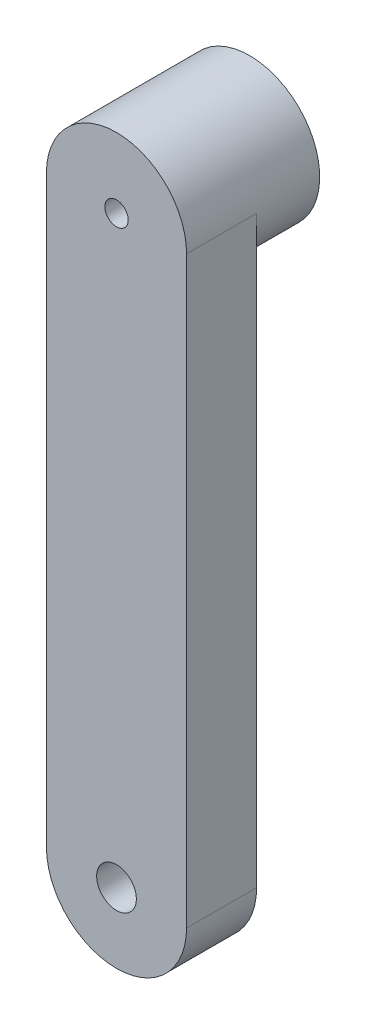
ISO-10303-21;
HEADER;
FILE_DESCRIPTION(('STEP AP214'),'2;1');
FILE_NAME('part.step','',(''),(''),'','','');
FILE_SCHEMA(('AUTOMOTIVE_DESIGN { 1 0 10303 214 1 1 1 1 }'));
ENDSEC;
DATA;
#1=APPLICATION_CONTEXT('core data for automotive mechanical design processes');
#2=APPLICATION_PROTOCOL_DEFINITION('international standard','automotive_design',2000,#1);
#3=PRODUCT_CONTEXT('',#1,'mechanical');
#4=PRODUCT('Part','Part','',(#3));
#5=PRODUCT_RELATED_PRODUCT_CATEGORY('part','',(#4));
#6=PRODUCT_DEFINITION_FORMATION('','',#4);
#7=PRODUCT_DEFINITION_CONTEXT('part definition',#1,'design');
#8=PRODUCT_DEFINITION('design','',#6,#7);
#9=PRODUCT_DEFINITION_SHAPE('','',#8);
#10=(LENGTH_UNIT() NAMED_UNIT(*) SI_UNIT(.MILLI.,.METRE.));
#11=(NAMED_UNIT(*) PLANE_ANGLE_UNIT() SI_UNIT($,.RADIAN.));
#12=(NAMED_UNIT(*) SI_UNIT($,.STERADIAN.) SOLID_ANGLE_UNIT());
#13=UNCERTAINTY_MEASURE_WITH_UNIT(LENGTH_MEASURE(1.E-05),#10,'distance_accuracy_value','');
#14=(GEOMETRIC_REPRESENTATION_CONTEXT(3) GLOBAL_UNCERTAINTY_ASSIGNED_CONTEXT((#13)) GLOBAL_UNIT_ASSIGNED_CONTEXT((#10,
#11,#12)) REPRESENTATION_CONTEXT('',''));
#15=CARTESIAN_POINT('',(0.,0.,0.));
#16=DIRECTION('',(0.,0.,1.));
#17=DIRECTION('',(1.,0.,0.));
#18=AXIS2_PLACEMENT_3D('',#15,#16,#17);
#19=CARTESIAN_POINT('',(0.,0.,3.));
#20=DIRECTION('',(0.,0.,-1.));
#21=DIRECTION('',(-1.,0.,0.));
#22=AXIS2_PLACEMENT_3D('',#19,#20,#21);
#23=CYLINDRICAL_SURFACE('',#22,3.);
#24=CARTESIAN_POINT('',(0.,0.,0.));
#25=DIRECTION('',(0.,0.,1.));
#26=DIRECTION('',(1.,0.,0.));
#27=AXIS2_PLACEMENT_3D('',#24,#25,#26);
#28=CIRCLE('',#27,3.);
#29=CARTESIAN_POINT('',(-3.,0.,0.));
#30=VERTEX_POINT('',#29);
#31=CARTESIAN_POINT('',(3.,0.,0.));
#32=VERTEX_POINT('',#31);
#33=EDGE_CURVE('E81',#30,#32,#28,.T.);
#34=ORIENTED_EDGE('',*,*,#33,.T.);
#35=DIRECTION('',(0.,0.,-1.));
#36=VECTOR('',#35,1.);
#37=CARTESIAN_POINT('',(3.,0.,3.));
#38=LINE('',#37,#36);
#39=CARTESIAN_POINT('',(3.,0.,3.));
#40=VERTEX_POINT('',#39);
#41=EDGE_CURVE('E35',#40,#32,#38,.T.);
#42=ORIENTED_EDGE('',*,*,#41,.F.);
#43=CARTESIAN_POINT('',(0.,0.,3.));
#44=DIRECTION('',(0.,0.,1.));
#45=DIRECTION('',(1.,0.,0.));
#46=AXIS2_PLACEMENT_3D('',#43,#44,#45);
#47=CIRCLE('',#46,3.);
#48=CARTESIAN_POINT('',(-3.,0.,3.));
#49=VERTEX_POINT('',#48);
#50=EDGE_CURVE('E82',#49,#40,#47,.T.);
#51=ORIENTED_EDGE('',*,*,#50,.F.);
#52=DIRECTION('',(0.,0.,-1.));
#53=VECTOR('',#52,1.);
#54=CARTESIAN_POINT('',(-3.,0.,3.));
#55=LINE('',#54,#53);
#56=EDGE_CURVE('E91',#49,#30,#55,.T.);
#57=ORIENTED_EDGE('',*,*,#56,.T.);
#58=EDGE_LOOP('',(#34,#42,#51,#57));
#59=FACE_BOUND('',#58,.T.);
#60=ADVANCED_FACE('F32',(#59),#23,.T.);
#61=CARTESIAN_POINT('',(3.,0.,3.));
#62=DIRECTION('',(-1.,0.,0.));
#63=DIRECTION('',(0.,0.,1.));
#64=AXIS2_PLACEMENT_3D('',#61,#62,#63);
#65=PLANE('',#64);
#66=DIRECTION('',(0.,1.,0.));
#67=VECTOR('',#66,1.);
#68=CARTESIAN_POINT('',(3.,0.,0.));
#69=LINE('',#68,#67);
#70=CARTESIAN_POINT('',(3.,25.,0.));
#71=VERTEX_POINT('',#70);
#72=EDGE_CURVE('E83',#32,#71,#69,.T.);
#73=ORIENTED_EDGE('',*,*,#72,.T.);
#74=DIRECTION('',(0.,0.,-1.));
#75=VECTOR('',#74,1.);
#76=CARTESIAN_POINT('',(3.,25.,3.));
#77=LINE('',#76,#75);
#78=CARTESIAN_POINT('',(3.,25.,3.));
#79=VERTEX_POINT('',#78);
#80=EDGE_CURVE('E90',#79,#71,#77,.T.);
#81=ORIENTED_EDGE('',*,*,#80,.F.);
#82=DIRECTION('',(0.,1.,0.));
#83=VECTOR('',#82,1.);
#84=CARTESIAN_POINT('',(3.,0.,3.));
#85=LINE('',#84,#83);
#86=EDGE_CURVE('E75',#40,#79,#85,.T.);
#87=ORIENTED_EDGE('',*,*,#86,.F.);
#88=ORIENTED_EDGE('',*,*,#41,.T.);
#89=EDGE_LOOP('',(#73,#81,#87,#88));
#90=FACE_BOUND('',#89,.T.);
#91=ADVANCED_FACE('F131',(#90),#65,.F.);
#92=CARTESIAN_POINT('',(0.,25.,3.));
#93=DIRECTION('',(0.,0.,-1.));
#94=DIRECTION('',(-1.,0.,0.));
#95=AXIS2_PLACEMENT_3D('',#92,#93,#94);
#96=CYLINDRICAL_SURFACE('',#95,3.);
#97=ORIENTED_EDGE('',*,*,#80,.T.);
#98=CARTESIAN_POINT('',(0.,25.,0.));
#99=DIRECTION('',(0.,0.,-1.));
#100=DIRECTION('',(-1.,0.,0.));
#101=AXIS2_PLACEMENT_3D('',#98,#99,#100);
#102=CIRCLE('',#101,3.);
#103=CARTESIAN_POINT('',(-3.,25.,0.));
#104=VERTEX_POINT('',#103);
#105=EDGE_CURVE('E11',#71,#104,#102,.T.);
#106=ORIENTED_EDGE('',*,*,#105,.T.);
#107=DIRECTION('',(0.,0.,-1.));
#108=VECTOR('',#107,1.);
#109=CARTESIAN_POINT('',(-3.,25.,3.));
#110=LINE('',#109,#108);
#111=CARTESIAN_POINT('',(-3.,25.,3.));
#112=VERTEX_POINT('',#111);
#113=EDGE_CURVE('E86',#112,#104,#110,.T.);
#114=ORIENTED_EDGE('',*,*,#113,.F.);
#115=CARTESIAN_POINT('',(0.,25.,3.));
#116=DIRECTION('',(0.,0.,1.));
#117=DIRECTION('',(1.,0.,0.));
#118=AXIS2_PLACEMENT_3D('',#115,#116,#117);
#119=CIRCLE('',#118,3.);
#120=EDGE_CURVE('E96',#79,#112,#119,.T.);
#121=ORIENTED_EDGE('',*,*,#120,.F.);
#122=EDGE_LOOP('',(#97,#106,#114,#121));
#123=FACE_BOUND('',#122,.T.);
#124=CARTESIAN_POINT('',(0.,25.,-2.7));
#125=DIRECTION('',(0.,0.,-1.));
#126=DIRECTION('',(-1.,0.,0.));
#127=AXIS2_PLACEMENT_3D('',#124,#125,#126);
#128=CIRCLE('',#127,3.);
#129=CARTESIAN_POINT('',(-3.,25.,-2.7));
#130=VERTEX_POINT('',#129);
#131=EDGE_CURVE('E110',#130,#130,#128,.T.);
#132=ORIENTED_EDGE('',*,*,#131,.F.);
#133=EDGE_LOOP('',(#132));
#134=FACE_BOUND('',#133,.T.);
#135=ADVANCED_FACE('F94',(#123,#134),#96,.T.);
#136=CARTESIAN_POINT('',(-3.,0.,3.));
#137=DIRECTION('',(1.,0.,0.));
#138=DIRECTION('',(0.,0.,-1.));
#139=AXIS2_PLACEMENT_3D('',#136,#137,#138);
#140=PLANE('',#139);
#141=DIRECTION('',(0.,-1.,0.));
#142=VECTOR('',#141,1.);
#143=CARTESIAN_POINT('',(-3.,0.,0.));
#144=LINE('',#143,#142);
#145=EDGE_CURVE('E67',#104,#30,#144,.T.);
#146=ORIENTED_EDGE('',*,*,#145,.T.);
#147=ORIENTED_EDGE('',*,*,#56,.F.);
#148=DIRECTION('',(0.,-1.,0.));
#149=VECTOR('',#148,1.);
#150=CARTESIAN_POINT('',(-3.,0.,3.));
#151=LINE('',#150,#149);
#152=EDGE_CURVE('E49',#112,#49,#151,.T.);
#153=ORIENTED_EDGE('',*,*,#152,.F.);
#154=ORIENTED_EDGE('',*,*,#113,.T.);
#155=EDGE_LOOP('',(#146,#147,#153,#154));
#156=FACE_BOUND('',#155,.T.);
#157=ADVANCED_FACE('F87',(#156),#140,.F.);
#158=CARTESIAN_POINT('',(0.,0.,3.));
#159=DIRECTION('',(0.,0.,1.));
#160=DIRECTION('',(1.,0.,0.));
#161=AXIS2_PLACEMENT_3D('',#158,#159,#160);
#162=PLANE('',#161);
#163=CARTESIAN_POINT('',(0.,25.,3.));
#164=DIRECTION('',(0.,0.,1.));
#165=DIRECTION('',(1.,0.,0.));
#166=AXIS2_PLACEMENT_3D('',#163,#164,#165);
#167=CIRCLE('',#166,0.5);
#168=CARTESIAN_POINT('',(0.5,25.,3.));
#169=VERTEX_POINT('',#168);
#170=EDGE_CURVE('E114',#169,#169,#167,.T.);
#171=ORIENTED_EDGE('',*,*,#170,.F.);
#172=EDGE_LOOP('',(#171));
#173=FACE_BOUND('',#172,.T.);
#174=CARTESIAN_POINT('',(0.,0.,3.));
#175=DIRECTION('',(0.,0.,1.));
#176=DIRECTION('',(1.,0.,0.));
#177=AXIS2_PLACEMENT_3D('',#174,#175,#176);
#178=CIRCLE('',#177,0.85);
#179=CARTESIAN_POINT('',(0.85,0.,3.));
#180=VERTEX_POINT('',#179);
#181=EDGE_CURVE('E108',#180,#180,#178,.T.);
#182=ORIENTED_EDGE('',*,*,#181,.F.);
#183=EDGE_LOOP('',(#182));
#184=FACE_BOUND('',#183,.T.);
#185=ORIENTED_EDGE('',*,*,#50,.T.);
#186=ORIENTED_EDGE('',*,*,#86,.T.);
#187=ORIENTED_EDGE('',*,*,#120,.T.);
#188=ORIENTED_EDGE('',*,*,#152,.T.);
#189=EDGE_LOOP('',(#185,#186,#187,#188));
#190=FACE_BOUND('',#189,.T.);
#191=ADVANCED_FACE('F123',(#173,#184,#190),#162,.T.);
#192=CARTESIAN_POINT('',(0.,0.,0.));
#193=DIRECTION('',(0.,0.,1.));
#194=DIRECTION('',(1.,0.,0.));
#195=AXIS2_PLACEMENT_3D('',#192,#193,#194);
#196=PLANE('',#195);
#197=ORIENTED_EDGE('',*,*,#105,.F.);
#198=ORIENTED_EDGE('',*,*,#72,.F.);
#199=ORIENTED_EDGE('',*,*,#33,.F.);
#200=ORIENTED_EDGE('',*,*,#145,.F.);
#201=EDGE_LOOP('',(#197,#198,#199,#200));
#202=FACE_BOUND('',#201,.T.);
#203=CARTESIAN_POINT('',(0.,0.,0.));
#204=DIRECTION('',(0.,0.,1.));
#205=DIRECTION('',(1.,0.,0.));
#206=AXIS2_PLACEMENT_3D('',#203,#204,#205);
#207=CIRCLE('',#206,0.85);
#208=CARTESIAN_POINT('',(0.85,0.,0.));
#209=VERTEX_POINT('',#208);
#210=EDGE_CURVE('E101',#209,#209,#207,.F.);
#211=ORIENTED_EDGE('',*,*,#210,.F.);
#212=EDGE_LOOP('',(#211));
#213=FACE_BOUND('',#212,.T.);
#214=ADVANCED_FACE('F78',(#202,#213),#196,.F.);
#215=CARTESIAN_POINT('',(0.,0.,-0.00100000000000013));
#216=DIRECTION('',(0.,0.,1.));
#217=DIRECTION('',(1.,0.,0.));
#218=AXIS2_PLACEMENT_3D('',#215,#216,#217);
#219=CYLINDRICAL_SURFACE('',#218,0.85);
#220=CARTESIAN_POINT('',(0.85,0.,3.));
#221=CARTESIAN_POINT('',(0.85,0.,2.96875));
#222=CARTESIAN_POINT('',(0.85,0.,2.9375));
#223=CARTESIAN_POINT('',(0.85,0.,2.875));
#224=CARTESIAN_POINT('',(0.85,0.,2.84375));
#225=CARTESIAN_POINT('',(0.85,0.,2.78125));
#226=CARTESIAN_POINT('',(0.85,0.,2.75));
#227=CARTESIAN_POINT('',(0.85,0.,2.6875));
#228=CARTESIAN_POINT('',(0.85,0.,2.65625));
#229=CARTESIAN_POINT('',(0.85,0.,2.59375));
#230=CARTESIAN_POINT('',(0.85,0.,2.5625));
#231=CARTESIAN_POINT('',(0.85,0.,2.5));
#232=CARTESIAN_POINT('',(0.85,0.,2.46875));
#233=CARTESIAN_POINT('',(0.85,0.,2.40625));
#234=CARTESIAN_POINT('',(0.85,0.,2.375));
#235=CARTESIAN_POINT('',(0.85,0.,2.3125));
#236=CARTESIAN_POINT('',(0.85,0.,2.28125));
#237=CARTESIAN_POINT('',(0.85,0.,2.21875));
#238=CARTESIAN_POINT('',(0.85,0.,2.1875));
#239=CARTESIAN_POINT('',(0.85,0.,2.125));
#240=CARTESIAN_POINT('',(0.85,0.,2.09375));
#241=CARTESIAN_POINT('',(0.85,0.,2.03125));
#242=CARTESIAN_POINT('',(0.85,0.,2.));
#243=CARTESIAN_POINT('',(0.85,0.,1.9375));
#244=CARTESIAN_POINT('',(0.85,0.,1.90625));
#245=CARTESIAN_POINT('',(0.85,0.,1.84375));
#246=CARTESIAN_POINT('',(0.85,0.,1.8125));
#247=CARTESIAN_POINT('',(0.85,0.,1.75));
#248=CARTESIAN_POINT('',(0.85,0.,1.71875));
#249=CARTESIAN_POINT('',(0.85,0.,1.65625));
#250=CARTESIAN_POINT('',(0.85,0.,1.625));
#251=CARTESIAN_POINT('',(0.85,0.,1.5625));
#252=CARTESIAN_POINT('',(0.85,0.,1.53125));
#253=CARTESIAN_POINT('',(0.85,0.,1.46875));
#254=CARTESIAN_POINT('',(0.85,0.,1.4375));
#255=CARTESIAN_POINT('',(0.85,0.,1.375));
#256=CARTESIAN_POINT('',(0.85,0.,1.34375));
#257=CARTESIAN_POINT('',(0.85,0.,1.28125));
#258=CARTESIAN_POINT('',(0.85,0.,1.25));
#259=CARTESIAN_POINT('',(0.85,0.,1.1875));
#260=CARTESIAN_POINT('',(0.85,0.,1.15625));
#261=CARTESIAN_POINT('',(0.85,0.,1.09375));
#262=CARTESIAN_POINT('',(0.85,0.,1.0625));
#263=CARTESIAN_POINT('',(0.85,0.,1.));
#264=CARTESIAN_POINT('',(0.85,0.,0.96875));
#265=CARTESIAN_POINT('',(0.85,0.,0.90625));
#266=CARTESIAN_POINT('',(0.85,0.,0.875));
#267=CARTESIAN_POINT('',(0.85,0.,0.8125));
#268=CARTESIAN_POINT('',(0.85,0.,0.78125));
#269=CARTESIAN_POINT('',(0.85,0.,0.71875));
#270=CARTESIAN_POINT('',(0.85,0.,0.6875));
#271=CARTESIAN_POINT('',(0.85,0.,0.625));
#272=CARTESIAN_POINT('',(0.85,0.,0.59375));
#273=CARTESIAN_POINT('',(0.85,0.,0.53125));
#274=CARTESIAN_POINT('',(0.85,0.,0.5));
#275=CARTESIAN_POINT('',(0.85,0.,0.4375));
#276=CARTESIAN_POINT('',(0.85,0.,0.40625));
#277=CARTESIAN_POINT('',(0.85,0.,0.34375));
#278=CARTESIAN_POINT('',(0.85,0.,0.3125));
#279=CARTESIAN_POINT('',(0.85,0.,0.25));
#280=CARTESIAN_POINT('',(0.85,0.,0.21875));
#281=CARTESIAN_POINT('',(0.85,0.,0.15625));
#282=CARTESIAN_POINT('',(0.85,0.,0.125));
#283=CARTESIAN_POINT('',(0.85,0.,0.0625000000000001));
#284=CARTESIAN_POINT('',(0.85,0.,0.0312500000000001));
#285=CARTESIAN_POINT('',(0.85,0.,0.));
#286=B_SPLINE_CURVE_WITH_KNOTS('',3,(#220,#221,#222,#223,#224,#225,#226,#227,#228,#229,#230,
#231,#232,#233,#234,#235,#236,#237,#238,#239,#240,#241,#242,#243,#244,#245,#246,#247,#248,#249,
#250,#251,#252,#253,#254,#255,#256,#257,#258,#259,#260,#261,#262,#263,#264,#265,#266,#267,#268,
#269,#270,#271,#272,#273,#274,#275,#276,#277,#278,#279,#280,#281,#282,#283,#284,#285),
.UNSPECIFIED.,.F.,.F.,(4,2,2,2,2,2,2,2,2,2,2,2,2,2,2,2,2,2,2,2,2,2,2,2,2,2,2,2,2,2,2,2,4),(0.,
0.0937500000000001,0.1875,0.28125,0.375,0.46875,0.5625,0.65625,0.75,0.84375,0.9375,1.03125,
1.125,1.21875,1.3125,1.40625,1.5,1.59375,1.6875,1.78125,1.875,1.96875,2.0625,2.15625,2.25,
2.34375,2.4375,2.53125,2.625,2.71875,2.8125,2.90625,3.),.UNSPECIFIED.);
#287=EDGE_CURVE('BSEAM142',#180,#209,#286,.T.);
#288=ORIENTED_EDGE('',*,*,#181,.T.);
#289=ORIENTED_EDGE('',*,*,#210,.T.);
#290=ORIENTED_EDGE('',*,*,#287,.T.);
#291=ORIENTED_EDGE('',*,*,#287,.F.);
#292=EDGE_LOOP('',(#288,#290,#289,#291));
#293=FACE_BOUND('',#292,.T.);
#294=ADVANCED_FACE('F142',(#293),#219,.F.);
#295=CARTESIAN_POINT('',(0.,25.,-2.7));
#296=DIRECTION('',(0.,0.,-1.));
#297=DIRECTION('',(-1.,0.,0.));
#298=AXIS2_PLACEMENT_3D('',#295,#296,#297);
#299=PLANE('',#298);
#300=CARTESIAN_POINT('',(0.,25.,-2.7));
#301=DIRECTION('',(0.,0.,-1.));
#302=DIRECTION('',(-1.,0.,0.));
#303=AXIS2_PLACEMENT_3D('',#300,#301,#302);
#304=CIRCLE('',#303,0.5);
#305=CARTESIAN_POINT('',(-0.5,25.,-2.7));
#306=VERTEX_POINT('',#305);
#307=EDGE_CURVE('E115',#306,#306,#304,.F.);
#308=ORIENTED_EDGE('',*,*,#307,.T.);
#309=EDGE_LOOP('',(#308));
#310=FACE_BOUND('',#309,.T.);
#311=ORIENTED_EDGE('',*,*,#131,.T.);
#312=EDGE_LOOP('',(#311));
#313=FACE_BOUND('',#312,.T.);
#314=ADVANCED_FACE('F146',(#310,#313),#299,.T.);
#315=CARTESIAN_POINT('',(0.,25.,-2.701));
#316=DIRECTION('',(0.,0.,1.));
#317=DIRECTION('',(1.,0.,0.));
#318=AXIS2_PLACEMENT_3D('',#315,#316,#317);
#319=CYLINDRICAL_SURFACE('',#318,0.5);
#320=ORIENTED_EDGE('',*,*,#307,.F.);
#321=EDGE_LOOP('',(#320));
#322=FACE_BOUND('',#321,.T.);
#323=ORIENTED_EDGE('',*,*,#170,.T.);
#324=EDGE_LOOP('',(#323));
#325=FACE_BOUND('',#324,.T.);
#326=ADVANCED_FACE('F121',(#322,#325),#319,.F.);
#327=CLOSED_SHELL('',(#60,#91,#135,#157,#191,#214,#294,#314,#326));
#328=MANIFOLD_SOLID_BREP('B2',#327);
#329=ADVANCED_BREP_SHAPE_REPRESENTATION('',(#18,#328),#14);
#330=SHAPE_DEFINITION_REPRESENTATION(#9,#329);
ENDSEC;
END-ISO-10303-21;
